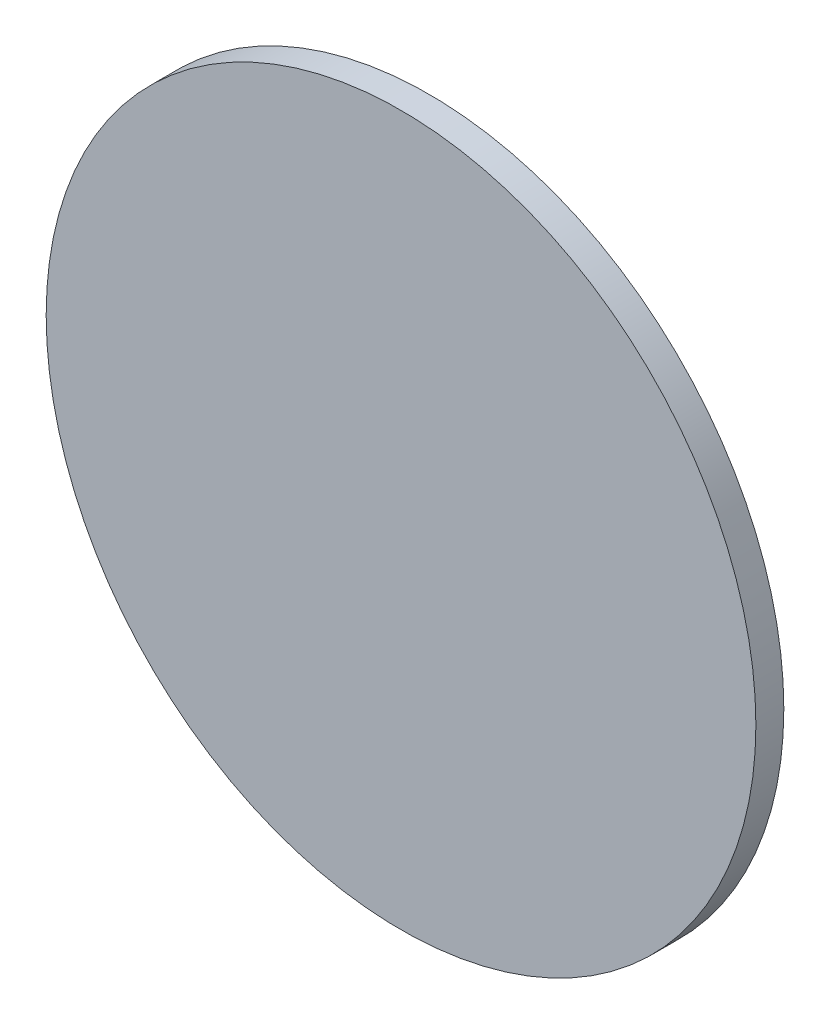
ISO-10303-21;
HEADER;
FILE_DESCRIPTION(('STEP AP214'),'2;1');
FILE_NAME('part.step','',(''),(''),'','','');
FILE_SCHEMA(('AUTOMOTIVE_DESIGN { 1 0 10303 214 1 1 1 1 }'));
ENDSEC;
DATA;
#1=APPLICATION_CONTEXT('core data for automotive mechanical design processes');
#2=APPLICATION_PROTOCOL_DEFINITION('international standard','automotive_design',2000,#1);
#3=PRODUCT_CONTEXT('',#1,'mechanical');
#4=PRODUCT('Part','Part','',(#3));
#5=PRODUCT_RELATED_PRODUCT_CATEGORY('part','',(#4));
#6=PRODUCT_DEFINITION_FORMATION('','',#4);
#7=PRODUCT_DEFINITION_CONTEXT('part definition',#1,'design');
#8=PRODUCT_DEFINITION('design','',#6,#7);
#9=PRODUCT_DEFINITION_SHAPE('','',#8);
#10=(LENGTH_UNIT() NAMED_UNIT(*) SI_UNIT(.MILLI.,.METRE.));
#11=(NAMED_UNIT(*) PLANE_ANGLE_UNIT() SI_UNIT($,.RADIAN.));
#12=(NAMED_UNIT(*) SI_UNIT($,.STERADIAN.) SOLID_ANGLE_UNIT());
#13=UNCERTAINTY_MEASURE_WITH_UNIT(LENGTH_MEASURE(1.E-05),#10,'distance_accuracy_value','');
#14=(GEOMETRIC_REPRESENTATION_CONTEXT(3) GLOBAL_UNCERTAINTY_ASSIGNED_CONTEXT((#13)) GLOBAL_UNIT_ASSIGNED_CONTEXT((#10,
#11,#12)) REPRESENTATION_CONTEXT('',''));
#15=CARTESIAN_POINT('',(0.,0.,0.));
#16=DIRECTION('',(0.,0.,1.));
#17=DIRECTION('',(1.,0.,0.));
#18=AXIS2_PLACEMENT_3D('',#15,#16,#17);
#19=CARTESIAN_POINT('',(0.,0.,5.));
#20=DIRECTION('',(0.,0.,-1.));
#21=DIRECTION('',(-1.,0.,0.));
#22=AXIS2_PLACEMENT_3D('',#19,#20,#21);
#23=CYLINDRICAL_SURFACE('',#22,63.5);
#24=CARTESIAN_POINT('',(0.,0.,5.));
#25=DIRECTION('',(0.,0.,1.));
#26=DIRECTION('',(1.,0.,0.));
#27=AXIS2_PLACEMENT_3D('',#24,#25,#26);
#28=CIRCLE('',#27,63.5);
#29=CARTESIAN_POINT('',(63.5,0.,5.));
#30=VERTEX_POINT('',#29);
#31=EDGE_CURVE('E10',#30,#30,#28,.T.);
#32=ORIENTED_EDGE('',*,*,#31,.F.);
#33=EDGE_LOOP('',(#32));
#34=FACE_BOUND('',#33,.T.);
#35=CARTESIAN_POINT('',(0.,0.,0.));
#36=DIRECTION('',(0.,0.,1.));
#37=DIRECTION('',(1.,0.,0.));
#38=AXIS2_PLACEMENT_3D('',#35,#36,#37);
#39=CIRCLE('',#38,63.5);
#40=CARTESIAN_POINT('',(63.5,0.,0.));
#41=VERTEX_POINT('',#40);
#42=EDGE_CURVE('E33',#41,#41,#39,.T.);
#43=ORIENTED_EDGE('',*,*,#42,.T.);
#44=EDGE_LOOP('',(#43));
#45=FACE_BOUND('',#44,.T.);
#46=ADVANCED_FACE('F30',(#34,#45),#23,.T.);
#47=CARTESIAN_POINT('',(0.,0.,5.));
#48=DIRECTION('',(0.,0.,1.));
#49=DIRECTION('',(1.,0.,0.));
#50=AXIS2_PLACEMENT_3D('',#47,#48,#49);
#51=PLANE('',#50);
#52=ORIENTED_EDGE('',*,*,#31,.T.);
#53=EDGE_LOOP('',(#52));
#54=FACE_BOUND('',#53,.T.);
#55=ADVANCED_FACE('F45',(#54),#51,.T.);
#56=CARTESIAN_POINT('',(0.,0.,0.));
#57=DIRECTION('',(0.,0.,1.));
#58=DIRECTION('',(1.,0.,0.));
#59=AXIS2_PLACEMENT_3D('',#56,#57,#58);
#60=PLANE('',#59);
#61=ORIENTED_EDGE('',*,*,#42,.F.);
#62=EDGE_LOOP('',(#61));
#63=FACE_BOUND('',#62,.T.);
#64=ADVANCED_FACE('F43',(#63),#60,.F.);
#65=CLOSED_SHELL('',(#46,#55,#64));
#66=MANIFOLD_SOLID_BREP('B2',#65);
#67=ADVANCED_BREP_SHAPE_REPRESENTATION('',(#18,#66),#14);
#68=SHAPE_DEFINITION_REPRESENTATION(#9,#67);
ENDSEC;
END-ISO-10303-21;
